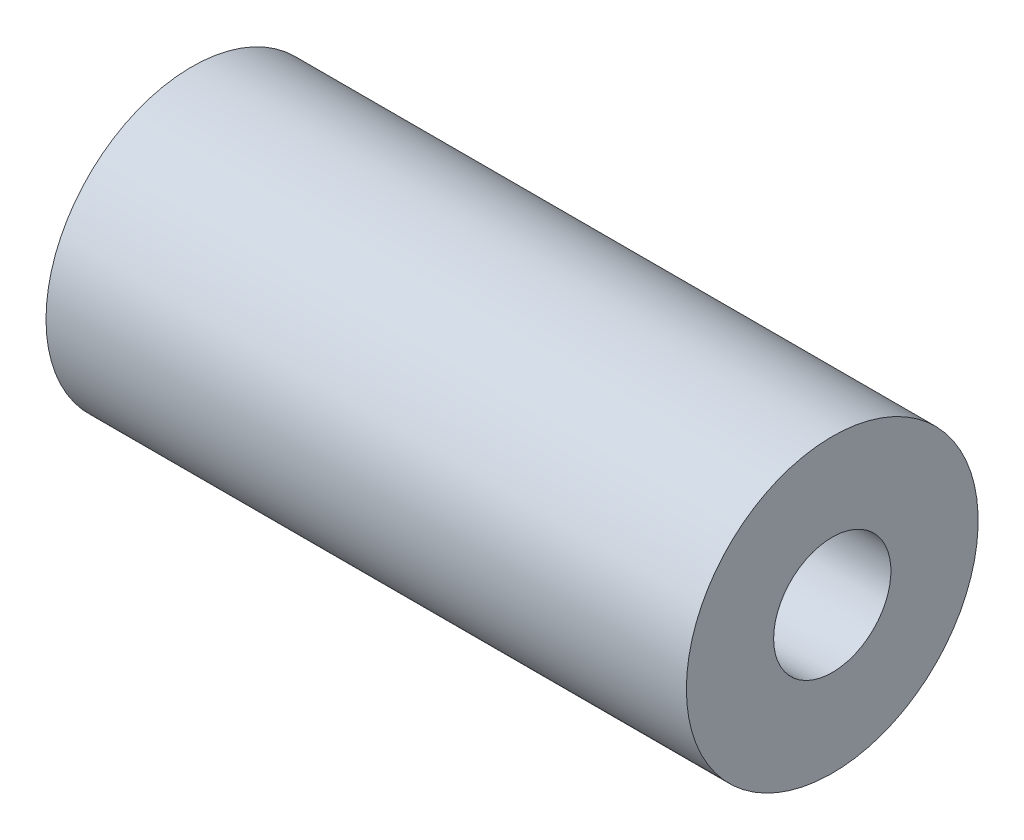
ISO-10303-21;
HEADER;
FILE_DESCRIPTION(('STEP AP214'),'2;1');
FILE_NAME('part.step','',(''),(''),'','','');
FILE_SCHEMA(('AUTOMOTIVE_DESIGN { 1 0 10303 214 1 1 1 1 }'));
ENDSEC;
DATA;
#1=APPLICATION_CONTEXT('core data for automotive mechanical design processes');
#2=APPLICATION_PROTOCOL_DEFINITION('international standard','automotive_design',2000,#1);
#3=PRODUCT_CONTEXT('',#1,'mechanical');
#4=PRODUCT('Part','Part','',(#3));
#5=PRODUCT_RELATED_PRODUCT_CATEGORY('part','',(#4));
#6=PRODUCT_DEFINITION_FORMATION('','',#4);
#7=PRODUCT_DEFINITION_CONTEXT('part definition',#1,'design');
#8=PRODUCT_DEFINITION('design','',#6,#7);
#9=PRODUCT_DEFINITION_SHAPE('','',#8);
#10=(LENGTH_UNIT() NAMED_UNIT(*) SI_UNIT(.MILLI.,.METRE.));
#11=(NAMED_UNIT(*) PLANE_ANGLE_UNIT() SI_UNIT($,.RADIAN.));
#12=(NAMED_UNIT(*) SI_UNIT($,.STERADIAN.) SOLID_ANGLE_UNIT());
#13=UNCERTAINTY_MEASURE_WITH_UNIT(LENGTH_MEASURE(1.E-05),#10,'distance_accuracy_value','');
#14=(GEOMETRIC_REPRESENTATION_CONTEXT(3) GLOBAL_UNCERTAINTY_ASSIGNED_CONTEXT((#13)) GLOBAL_UNIT_ASSIGNED_CONTEXT((#10,
#11,#12)) REPRESENTATION_CONTEXT('',''));
#15=CARTESIAN_POINT('',(0.,0.,0.));
#16=DIRECTION('',(0.,0.,1.));
#17=DIRECTION('',(1.,0.,0.));
#18=AXIS2_PLACEMENT_3D('',#15,#16,#17);
#19=CARTESIAN_POINT('',(27.875200028,0.,0.));
#20=DIRECTION('',(1.,0.,0.));
#21=DIRECTION('',(0.,0.,-1.));
#22=AXIS2_PLACEMENT_3D('',#19,#20,#21);
#23=PLANE('',#22);
#24=CARTESIAN_POINT('',(27.875200028,0.,0.));
#25=DIRECTION('',(1.,0.,0.));
#26=DIRECTION('',(0.,0.,-1.));
#27=AXIS2_PLACEMENT_3D('',#24,#25,#26);
#28=CIRCLE('',#27,6.35);
#29=CARTESIAN_POINT('',(27.875200028,0.,6.35));
#30=VERTEX_POINT('',#29);
#31=EDGE_CURVE('E10',#30,#30,#28,.T.);
#32=ORIENTED_EDGE('',*,*,#31,.T.);
#33=EDGE_LOOP('',(#32));
#34=FACE_BOUND('',#33,.T.);
#35=CARTESIAN_POINT('',(27.875200028,0.,0.));
#36=DIRECTION('',(1.,0.,0.));
#37=DIRECTION('',(0.,0.,-1.));
#38=AXIS2_PLACEMENT_3D('',#35,#36,#37);
#39=CIRCLE('',#38,2.5527);
#40=CARTESIAN_POINT('',(27.875200028,0.,2.5527));
#41=VERTEX_POINT('',#40);
#42=EDGE_CURVE('E42',#41,#41,#39,.T.);
#43=ORIENTED_EDGE('',*,*,#42,.F.);
#44=EDGE_LOOP('',(#43));
#45=FACE_BOUND('',#44,.T.);
#46=ADVANCED_FACE('F31',(#34,#45),#23,.T.);
#47=CARTESIAN_POINT('',(0.,0.,0.));
#48=DIRECTION('',(1.,0.,0.));
#49=DIRECTION('',(0.,0.,-1.));
#50=AXIS2_PLACEMENT_3D('',#47,#48,#49);
#51=PLANE('',#50);
#52=CARTESIAN_POINT('',(0.,0.,0.));
#53=DIRECTION('',(1.,0.,0.));
#54=DIRECTION('',(0.,0.,-1.));
#55=AXIS2_PLACEMENT_3D('',#52,#53,#54);
#56=CIRCLE('',#55,6.35);
#57=CARTESIAN_POINT('',(0.,0.,6.35));
#58=VERTEX_POINT('',#57);
#59=EDGE_CURVE('E35',#58,#58,#56,.T.);
#60=ORIENTED_EDGE('',*,*,#59,.F.);
#61=EDGE_LOOP('',(#60));
#62=FACE_BOUND('',#61,.T.);
#63=CARTESIAN_POINT('',(0.,0.,0.));
#64=DIRECTION('',(1.,0.,0.));
#65=DIRECTION('',(0.,0.,-1.));
#66=AXIS2_PLACEMENT_3D('',#63,#64,#65);
#67=CIRCLE('',#66,2.5527);
#68=CARTESIAN_POINT('',(0.,0.,2.5527));
#69=VERTEX_POINT('',#68);
#70=EDGE_CURVE('E44',#69,#69,#67,.T.);
#71=ORIENTED_EDGE('',*,*,#70,.T.);
#72=EDGE_LOOP('',(#71));
#73=FACE_BOUND('',#72,.T.);
#74=ADVANCED_FACE('F54',(#62,#73),#51,.F.);
#75=CARTESIAN_POINT('',(27.875200028,0.,0.));
#76=DIRECTION('',(-1.,0.,0.));
#77=DIRECTION('',(0.,0.,1.));
#78=AXIS2_PLACEMENT_3D('',#75,#76,#77);
#79=CYLINDRICAL_SURFACE('',#78,6.35);
#80=CARTESIAN_POINT('',(27.875200028,0.,6.35));
#81=CARTESIAN_POINT('',(27.5848333610417,0.,6.35));
#82=CARTESIAN_POINT('',(27.2944666940833,0.,6.35));
#83=CARTESIAN_POINT('',(26.7137333601667,0.,6.35));
#84=CARTESIAN_POINT('',(26.4233666932083,0.,6.35));
#85=CARTESIAN_POINT('',(25.8426333592917,0.,6.35));
#86=CARTESIAN_POINT('',(25.5522666923333,0.,6.35));
#87=CARTESIAN_POINT('',(24.9715333584167,0.,6.35));
#88=CARTESIAN_POINT('',(24.6811666914583,0.,6.35));
#89=CARTESIAN_POINT('',(24.1004333575417,0.,6.35));
#90=CARTESIAN_POINT('',(23.8100666905833,0.,6.35));
#91=CARTESIAN_POINT('',(23.2293333566667,0.,6.35));
#92=CARTESIAN_POINT('',(22.9389666897083,0.,6.35));
#93=CARTESIAN_POINT('',(22.3582333557917,0.,6.35));
#94=CARTESIAN_POINT('',(22.0678666888333,0.,6.35));
#95=CARTESIAN_POINT('',(21.4871333549167,0.,6.35));
#96=CARTESIAN_POINT('',(21.1967666879583,0.,6.35));
#97=CARTESIAN_POINT('',(20.6160333540417,0.,6.35));
#98=CARTESIAN_POINT('',(20.3256666870833,0.,6.35));
#99=CARTESIAN_POINT('',(19.7449333531667,0.,6.35));
#100=CARTESIAN_POINT('',(19.4545666862083,0.,6.35));
#101=CARTESIAN_POINT('',(18.8738333522917,0.,6.35));
#102=CARTESIAN_POINT('',(18.5834666853333,0.,6.35));
#103=CARTESIAN_POINT('',(18.0027333514167,0.,6.35));
#104=CARTESIAN_POINT('',(17.7123666844583,0.,6.35));
#105=CARTESIAN_POINT('',(17.1316333505417,0.,6.35));
#106=CARTESIAN_POINT('',(16.8412666835833,0.,6.35));
#107=CARTESIAN_POINT('',(16.2605333496667,0.,6.35));
#108=CARTESIAN_POINT('',(15.9701666827083,0.,6.35));
#109=CARTESIAN_POINT('',(15.3894333487917,0.,6.35));
#110=CARTESIAN_POINT('',(15.0990666818333,0.,6.35));
#111=CARTESIAN_POINT('',(14.5183333479167,0.,6.35));
#112=CARTESIAN_POINT('',(14.2279666809583,0.,6.35));
#113=CARTESIAN_POINT('',(13.6472333470417,0.,6.35));
#114=CARTESIAN_POINT('',(13.3568666800833,0.,6.35));
#115=CARTESIAN_POINT('',(12.7761333461667,0.,6.35));
#116=CARTESIAN_POINT('',(12.4857666792083,0.,6.35));
#117=CARTESIAN_POINT('',(11.9050333452917,0.,6.35));
#118=CARTESIAN_POINT('',(11.6146666783333,0.,6.35));
#119=CARTESIAN_POINT('',(11.0339333444167,0.,6.35));
#120=CARTESIAN_POINT('',(10.7435666774583,0.,6.35));
#121=CARTESIAN_POINT('',(10.1628333435417,0.,6.35));
#122=CARTESIAN_POINT('',(9.87246667658333,0.,6.35));
#123=CARTESIAN_POINT('',(9.29173334266666,0.,6.35));
#124=CARTESIAN_POINT('',(9.00136667570833,0.,6.35));
#125=CARTESIAN_POINT('',(8.42063334179166,0.,6.35));
#126=CARTESIAN_POINT('',(8.13026667483333,0.,6.35));
#127=CARTESIAN_POINT('',(7.54953334091666,0.,6.35));
#128=CARTESIAN_POINT('',(7.25916667395833,0.,6.35));
#129=CARTESIAN_POINT('',(6.67843334004167,0.,6.35));
#130=CARTESIAN_POINT('',(6.38806667308333,0.,6.35));
#131=CARTESIAN_POINT('',(5.80733333916666,0.,6.35));
#132=CARTESIAN_POINT('',(5.51696667220833,0.,6.35));
#133=CARTESIAN_POINT('',(4.93623333829166,0.,6.35));
#134=CARTESIAN_POINT('',(4.64586667133333,0.,6.35));
#135=CARTESIAN_POINT('',(4.06513333741667,0.,6.35));
#136=CARTESIAN_POINT('',(3.77476667045833,0.,6.35));
#137=CARTESIAN_POINT('',(3.19403333654166,0.,6.35));
#138=CARTESIAN_POINT('',(2.90366666958333,0.,6.35));
#139=CARTESIAN_POINT('',(2.32293333566666,0.,6.35));
#140=CARTESIAN_POINT('',(2.03256666870833,0.,6.35));
#141=CARTESIAN_POINT('',(1.45183333479166,0.,6.35));
#142=CARTESIAN_POINT('',(1.16146666783333,0.,6.35));
#143=CARTESIAN_POINT('',(0.580733333916664,0.,6.35));
#144=CARTESIAN_POINT('',(0.29036666695833,0.,6.35));
#145=CARTESIAN_POINT('',(0.,0.,6.35));
#146=B_SPLINE_CURVE_WITH_KNOTS('',3,(#80,#81,#82,#83,#84,#85,#86,#87,#88,#89,#90,#91,#92,#93,
#94,#95,#96,#97,#98,#99,#100,#101,#102,#103,#104,#105,#106,#107,#108,#109,#110,#111,#112,#113,
#114,#115,#116,#117,#118,#119,#120,#121,#122,#123,#124,#125,#126,#127,#128,#129,#130,#131,#132,
#133,#134,#135,#136,#137,#138,#139,#140,#141,#142,#143,#144,#145),.UNSPECIFIED.,.F.,.F.,(4,2,2,
2,2,2,2,2,2,2,2,2,2,2,2,2,2,2,2,2,2,2,2,2,2,2,2,2,2,2,2,2,4),(0.,0.871100000874998,
1.74220000175,2.613300002625,3.4844000035,4.355500004375,5.22660000525,6.097700006125,
6.968800007,7.839900007875,8.71100000875,9.582100009625,10.4532000105,11.324300011375,
12.19540001225,13.066500013125,13.937600014,14.808700014875,15.67980001575,16.550900016625,
17.4220000175,18.293100018375,19.16420001925,20.035300020125,20.906400021,21.777500021875,
22.64860002275,23.519700023625,24.3908000245,25.261900025375,26.13300002625,27.004100027125,
27.875200028),.UNSPECIFIED.);
#147=EDGE_CURVE('BSEAM33',#30,#58,#146,.T.);
#148=ORIENTED_EDGE('',*,*,#31,.F.);
#149=ORIENTED_EDGE('',*,*,#59,.T.);
#150=ORIENTED_EDGE('',*,*,#147,.T.);
#151=ORIENTED_EDGE('',*,*,#147,.F.);
#152=EDGE_LOOP('',(#148,#150,#149,#151));
#153=FACE_BOUND('',#152,.T.);
#154=ADVANCED_FACE('F33',(#153),#79,.T.);
#155=CARTESIAN_POINT('',(27.875200028,0.,0.));
#156=DIRECTION('',(-1.,0.,0.));
#157=DIRECTION('',(0.,0.,1.));
#158=AXIS2_PLACEMENT_3D('',#155,#156,#157);
#159=CYLINDRICAL_SURFACE('',#158,2.5527);
#160=CARTESIAN_POINT('',(27.875200028,0.,2.5527));
#161=CARTESIAN_POINT('',(27.5848333610417,0.,2.5527));
#162=CARTESIAN_POINT('',(27.2944666940833,0.,2.5527));
#163=CARTESIAN_POINT('',(26.7137333601667,0.,2.5527));
#164=CARTESIAN_POINT('',(26.4233666932083,0.,2.5527));
#165=CARTESIAN_POINT('',(25.8426333592917,0.,2.5527));
#166=CARTESIAN_POINT('',(25.5522666923333,0.,2.5527));
#167=CARTESIAN_POINT('',(24.9715333584167,0.,2.5527));
#168=CARTESIAN_POINT('',(24.6811666914583,0.,2.5527));
#169=CARTESIAN_POINT('',(24.1004333575417,0.,2.5527));
#170=CARTESIAN_POINT('',(23.8100666905833,0.,2.5527));
#171=CARTESIAN_POINT('',(23.2293333566667,0.,2.5527));
#172=CARTESIAN_POINT('',(22.9389666897083,0.,2.5527));
#173=CARTESIAN_POINT('',(22.3582333557917,0.,2.5527));
#174=CARTESIAN_POINT('',(22.0678666888333,0.,2.5527));
#175=CARTESIAN_POINT('',(21.4871333549167,0.,2.5527));
#176=CARTESIAN_POINT('',(21.1967666879583,0.,2.5527));
#177=CARTESIAN_POINT('',(20.6160333540417,0.,2.5527));
#178=CARTESIAN_POINT('',(20.3256666870833,0.,2.5527));
#179=CARTESIAN_POINT('',(19.7449333531667,0.,2.5527));
#180=CARTESIAN_POINT('',(19.4545666862083,0.,2.5527));
#181=CARTESIAN_POINT('',(18.8738333522917,0.,2.5527));
#182=CARTESIAN_POINT('',(18.5834666853333,0.,2.5527));
#183=CARTESIAN_POINT('',(18.0027333514167,0.,2.5527));
#184=CARTESIAN_POINT('',(17.7123666844583,0.,2.5527));
#185=CARTESIAN_POINT('',(17.1316333505417,0.,2.5527));
#186=CARTESIAN_POINT('',(16.8412666835833,0.,2.5527));
#187=CARTESIAN_POINT('',(16.2605333496667,0.,2.5527));
#188=CARTESIAN_POINT('',(15.9701666827083,0.,2.5527));
#189=CARTESIAN_POINT('',(15.3894333487917,0.,2.5527));
#190=CARTESIAN_POINT('',(15.0990666818333,0.,2.5527));
#191=CARTESIAN_POINT('',(14.5183333479167,0.,2.5527));
#192=CARTESIAN_POINT('',(14.2279666809583,0.,2.5527));
#193=CARTESIAN_POINT('',(13.6472333470417,0.,2.5527));
#194=CARTESIAN_POINT('',(13.3568666800833,0.,2.5527));
#195=CARTESIAN_POINT('',(12.7761333461667,0.,2.5527));
#196=CARTESIAN_POINT('',(12.4857666792083,0.,2.5527));
#197=CARTESIAN_POINT('',(11.9050333452917,0.,2.5527));
#198=CARTESIAN_POINT('',(11.6146666783333,0.,2.5527));
#199=CARTESIAN_POINT('',(11.0339333444167,0.,2.5527));
#200=CARTESIAN_POINT('',(10.7435666774583,0.,2.5527));
#201=CARTESIAN_POINT('',(10.1628333435417,0.,2.5527));
#202=CARTESIAN_POINT('',(9.87246667658333,0.,2.5527));
#203=CARTESIAN_POINT('',(9.29173334266667,0.,2.5527));
#204=CARTESIAN_POINT('',(9.00136667570833,0.,2.5527));
#205=CARTESIAN_POINT('',(8.42063334179167,0.,2.5527));
#206=CARTESIAN_POINT('',(8.13026667483333,0.,2.5527));
#207=CARTESIAN_POINT('',(7.54953334091667,0.,2.5527));
#208=CARTESIAN_POINT('',(7.25916667395833,0.,2.5527));
#209=CARTESIAN_POINT('',(6.67843334004167,0.,2.5527));
#210=CARTESIAN_POINT('',(6.38806667308333,0.,2.5527));
#211=CARTESIAN_POINT('',(5.80733333916666,0.,2.5527));
#212=CARTESIAN_POINT('',(5.51696667220833,0.,2.5527));
#213=CARTESIAN_POINT('',(4.93623333829166,0.,2.5527));
#214=CARTESIAN_POINT('',(4.64586667133333,0.,2.5527));
#215=CARTESIAN_POINT('',(4.06513333741667,0.,2.5527));
#216=CARTESIAN_POINT('',(3.77476667045833,0.,2.5527));
#217=CARTESIAN_POINT('',(3.19403333654166,0.,2.5527));
#218=CARTESIAN_POINT('',(2.90366666958333,0.,2.5527));
#219=CARTESIAN_POINT('',(2.32293333566666,0.,2.5527));
#220=CARTESIAN_POINT('',(2.03256666870833,0.,2.5527));
#221=CARTESIAN_POINT('',(1.45183333479166,0.,2.5527));
#222=CARTESIAN_POINT('',(1.16146666783333,0.,2.5527));
#223=CARTESIAN_POINT('',(0.580733333916664,0.,2.5527));
#224=CARTESIAN_POINT('',(0.29036666695833,0.,2.5527));
#225=CARTESIAN_POINT('',(0.,0.,2.5527));
#226=B_SPLINE_CURVE_WITH_KNOTS('',3,(#160,#161,#162,#163,#164,#165,#166,#167,#168,#169,#170,
#171,#172,#173,#174,#175,#176,#177,#178,#179,#180,#181,#182,#183,#184,#185,#186,#187,#188,#189,
#190,#191,#192,#193,#194,#195,#196,#197,#198,#199,#200,#201,#202,#203,#204,#205,#206,#207,#208,
#209,#210,#211,#212,#213,#214,#215,#216,#217,#218,#219,#220,#221,#222,#223,#224,#225),
.UNSPECIFIED.,.F.,.F.,(4,2,2,2,2,2,2,2,2,2,2,2,2,2,2,2,2,2,2,2,2,2,2,2,2,2,2,2,2,2,2,2,4),(0.,
0.871100000875001,1.74220000175,2.613300002625,3.4844000035,4.355500004375,5.22660000525,
6.097700006125,6.968800007,7.839900007875,8.71100000875,9.582100009625,10.4532000105,
11.324300011375,12.19540001225,13.066500013125,13.937600014,14.808700014875,15.67980001575,
16.550900016625,17.4220000175,18.293100018375,19.16420001925,20.035300020125,20.906400021,
21.777500021875,22.64860002275,23.519700023625,24.3908000245,25.261900025375,26.13300002625,
27.004100027125,27.875200028),.UNSPECIFIED.);
#227=EDGE_CURVE('BSEAM50',#41,#69,#226,.T.);
#228=ORIENTED_EDGE('',*,*,#42,.T.);
#229=ORIENTED_EDGE('',*,*,#70,.F.);
#230=ORIENTED_EDGE('',*,*,#227,.T.);
#231=ORIENTED_EDGE('',*,*,#227,.F.);
#232=EDGE_LOOP('',(#228,#230,#229,#231));
#233=FACE_BOUND('',#232,.T.);
#234=ADVANCED_FACE('F50',(#233),#159,.F.);
#235=CLOSED_SHELL('',(#46,#74,#154,#234));
#236=MANIFOLD_SOLID_BREP('B2',#235);
#237=ADVANCED_BREP_SHAPE_REPRESENTATION('',(#18,#236),#14);
#238=SHAPE_DEFINITION_REPRESENTATION(#9,#237);
ENDSEC;
END-ISO-10303-21;
